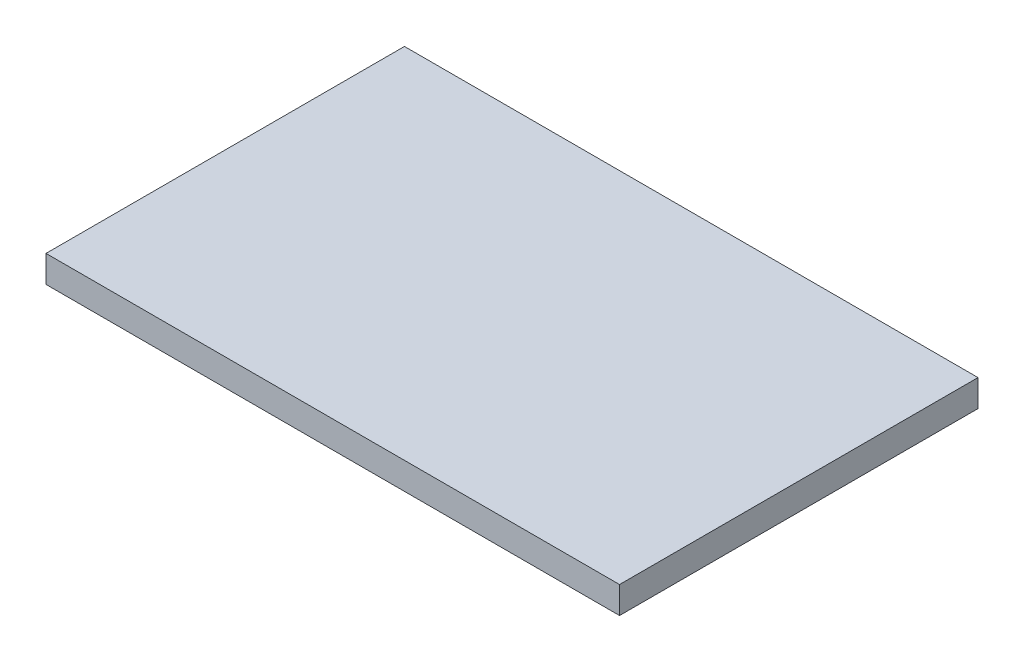
ISO-10303-21;
HEADER;
FILE_DESCRIPTION(('STEP AP214'),'2;1');
FILE_NAME('part.step','',(''),(''),'','','');
FILE_SCHEMA(('AUTOMOTIVE_DESIGN { 1 0 10303 214 1 1 1 1 }'));
ENDSEC;
DATA;
#1=APPLICATION_CONTEXT('core data for automotive mechanical design processes');
#2=APPLICATION_PROTOCOL_DEFINITION('international standard','automotive_design',2000,#1);
#3=PRODUCT_CONTEXT('',#1,'mechanical');
#4=PRODUCT('Part','Part','',(#3));
#5=PRODUCT_RELATED_PRODUCT_CATEGORY('part','',(#4));
#6=PRODUCT_DEFINITION_FORMATION('','',#4);
#7=PRODUCT_DEFINITION_CONTEXT('part definition',#1,'design');
#8=PRODUCT_DEFINITION('design','',#6,#7);
#9=PRODUCT_DEFINITION_SHAPE('','',#8);
#10=(LENGTH_UNIT() NAMED_UNIT(*) SI_UNIT(.MILLI.,.METRE.));
#11=(NAMED_UNIT(*) PLANE_ANGLE_UNIT() SI_UNIT($,.RADIAN.));
#12=(NAMED_UNIT(*) SI_UNIT($,.STERADIAN.) SOLID_ANGLE_UNIT());
#13=UNCERTAINTY_MEASURE_WITH_UNIT(LENGTH_MEASURE(1.E-05),#10,'distance_accuracy_value','');
#14=(GEOMETRIC_REPRESENTATION_CONTEXT(3) GLOBAL_UNCERTAINTY_ASSIGNED_CONTEXT((#13)) GLOBAL_UNIT_ASSIGNED_CONTEXT((#10,
#11,#12)) REPRESENTATION_CONTEXT('',''));
#15=CARTESIAN_POINT('',(0.,0.,0.));
#16=DIRECTION('',(0.,0.,1.));
#17=DIRECTION('',(1.,0.,0.));
#18=AXIS2_PLACEMENT_3D('',#15,#16,#17);
#19=CARTESIAN_POINT('',(-16.,-0.750000000000004,20.));
#20=DIRECTION('',(1.,0.,0.));
#21=DIRECTION('',(0.,0.,-1.));
#22=AXIS2_PLACEMENT_3D('',#19,#20,#21);
#23=PLANE('',#22);
#24=DIRECTION('',(0.,-1.,0.));
#25=VECTOR('',#24,1.);
#26=CARTESIAN_POINT('',(-16.,-0.750000000000004,0.));
#27=LINE('',#26,#25);
#28=CARTESIAN_POINT('',(-16.,0.749999999999996,0.));
#29=VERTEX_POINT('',#28);
#30=CARTESIAN_POINT('',(-16.,-0.750000000000004,0.));
#31=VERTEX_POINT('',#30);
#32=EDGE_CURVE('E113',#29,#31,#27,.T.);
#33=ORIENTED_EDGE('',*,*,#32,.T.);
#34=DIRECTION('',(0.,0.,-1.));
#35=VECTOR('',#34,1.);
#36=CARTESIAN_POINT('',(-16.,-0.750000000000004,20.));
#37=LINE('',#36,#35);
#38=CARTESIAN_POINT('',(-16.,-0.750000000000004,20.));
#39=VERTEX_POINT('',#38);
#40=EDGE_CURVE('E11',#39,#31,#37,.T.);
#41=ORIENTED_EDGE('',*,*,#40,.F.);
#42=DIRECTION('',(0.,-1.,0.));
#43=VECTOR('',#42,1.);
#44=CARTESIAN_POINT('',(-16.,-0.750000000000004,20.));
#45=LINE('',#44,#43);
#46=CARTESIAN_POINT('',(-16.,0.749999999999996,20.));
#47=VERTEX_POINT('',#46);
#48=EDGE_CURVE('E97',#47,#39,#45,.T.);
#49=ORIENTED_EDGE('',*,*,#48,.F.);
#50=DIRECTION('',(0.,0.,-1.));
#51=VECTOR('',#50,1.);
#52=CARTESIAN_POINT('',(-16.,0.749999999999996,20.));
#53=LINE('',#52,#51);
#54=EDGE_CURVE('E109',#47,#29,#53,.T.);
#55=ORIENTED_EDGE('',*,*,#54,.T.);
#56=EDGE_LOOP('',(#33,#41,#49,#55));
#57=FACE_BOUND('',#56,.T.);
#58=ADVANCED_FACE('F45',(#57),#23,.F.);
#59=CARTESIAN_POINT('',(16.,-0.749999999999994,20.));
#60=DIRECTION('',(0.,1.,0.));
#61=DIRECTION('',(-1.,0.,0.));
#62=AXIS2_PLACEMENT_3D('',#59,#60,#61);
#63=PLANE('',#62);
#64=DIRECTION('',(1.,0.,0.));
#65=VECTOR('',#64,1.);
#66=CARTESIAN_POINT('',(16.,-0.749999999999994,0.));
#67=LINE('',#66,#65);
#68=CARTESIAN_POINT('',(16.,-0.749999999999994,0.));
#69=VERTEX_POINT('',#68);
#70=EDGE_CURVE('E102',#31,#69,#67,.T.);
#71=ORIENTED_EDGE('',*,*,#70,.T.);
#72=DIRECTION('',(0.,0.,-1.));
#73=VECTOR('',#72,1.);
#74=CARTESIAN_POINT('',(16.,-0.749999999999994,20.));
#75=LINE('',#74,#73);
#76=CARTESIAN_POINT('',(16.,-0.749999999999994,20.));
#77=VERTEX_POINT('',#76);
#78=EDGE_CURVE('E54',#77,#69,#75,.T.);
#79=ORIENTED_EDGE('',*,*,#78,.F.);
#80=DIRECTION('',(1.,0.,0.));
#81=VECTOR('',#80,1.);
#82=CARTESIAN_POINT('',(16.,-0.749999999999994,20.));
#83=LINE('',#82,#81);
#84=EDGE_CURVE('E92',#39,#77,#83,.T.);
#85=ORIENTED_EDGE('',*,*,#84,.F.);
#86=ORIENTED_EDGE('',*,*,#40,.T.);
#87=EDGE_LOOP('',(#71,#79,#85,#86));
#88=FACE_BOUND('',#87,.T.);
#89=ADVANCED_FACE('F101',(#88),#63,.F.);
#90=CARTESIAN_POINT('',(16.,-0.749999999999994,20.));
#91=DIRECTION('',(-1.,0.,0.));
#92=DIRECTION('',(0.,0.,1.));
#93=AXIS2_PLACEMENT_3D('',#90,#91,#92);
#94=PLANE('',#93);
#95=DIRECTION('',(0.,1.,0.));
#96=VECTOR('',#95,1.);
#97=CARTESIAN_POINT('',(16.,-0.749999999999994,0.));
#98=LINE('',#97,#96);
#99=CARTESIAN_POINT('',(16.,0.750000000000006,0.));
#100=VERTEX_POINT('',#99);
#101=EDGE_CURVE('E79',#69,#100,#98,.T.);
#102=ORIENTED_EDGE('',*,*,#101,.T.);
#103=DIRECTION('',(0.,0.,-1.));
#104=VECTOR('',#103,1.);
#105=CARTESIAN_POINT('',(16.,0.750000000000006,20.));
#106=LINE('',#105,#104);
#107=CARTESIAN_POINT('',(16.,0.750000000000006,20.));
#108=VERTEX_POINT('',#107);
#109=EDGE_CURVE('E104',#108,#100,#106,.T.);
#110=ORIENTED_EDGE('',*,*,#109,.F.);
#111=DIRECTION('',(0.,1.,0.));
#112=VECTOR('',#111,1.);
#113=CARTESIAN_POINT('',(16.,-0.749999999999994,20.));
#114=LINE('',#113,#112);
#115=EDGE_CURVE('E95',#77,#108,#114,.T.);
#116=ORIENTED_EDGE('',*,*,#115,.F.);
#117=ORIENTED_EDGE('',*,*,#78,.T.);
#118=EDGE_LOOP('',(#102,#110,#116,#117));
#119=FACE_BOUND('',#118,.T.);
#120=ADVANCED_FACE('F105',(#119),#94,.F.);
#121=CARTESIAN_POINT('',(16.,0.750000000000006,20.));
#122=DIRECTION('',(0.,-1.,0.));
#123=DIRECTION('',(1.,0.,0.));
#124=AXIS2_PLACEMENT_3D('',#121,#122,#123);
#125=PLANE('',#124);
#126=DIRECTION('',(-1.,0.,0.));
#127=VECTOR('',#126,1.);
#128=CARTESIAN_POINT('',(16.,0.750000000000006,0.));
#129=LINE('',#128,#127);
#130=EDGE_CURVE('E85',#100,#29,#129,.T.);
#131=ORIENTED_EDGE('',*,*,#130,.T.);
#132=ORIENTED_EDGE('',*,*,#54,.F.);
#133=DIRECTION('',(-1.,0.,0.));
#134=VECTOR('',#133,1.);
#135=CARTESIAN_POINT('',(16.,0.750000000000006,20.));
#136=LINE('',#135,#134);
#137=EDGE_CURVE('E62',#108,#47,#136,.T.);
#138=ORIENTED_EDGE('',*,*,#137,.F.);
#139=ORIENTED_EDGE('',*,*,#109,.T.);
#140=EDGE_LOOP('',(#131,#132,#138,#139));
#141=FACE_BOUND('',#140,.T.);
#142=ADVANCED_FACE('F126',(#141),#125,.F.);
#143=CARTESIAN_POINT('',(0.,0.,20.));
#144=DIRECTION('',(0.,0.,1.));
#145=DIRECTION('',(1.,0.,0.));
#146=AXIS2_PLACEMENT_3D('',#143,#144,#145);
#147=PLANE('',#146);
#148=ORIENTED_EDGE('',*,*,#48,.T.);
#149=ORIENTED_EDGE('',*,*,#84,.T.);
#150=ORIENTED_EDGE('',*,*,#115,.T.);
#151=ORIENTED_EDGE('',*,*,#137,.T.);
#152=EDGE_LOOP('',(#148,#149,#150,#151));
#153=FACE_BOUND('',#152,.T.);
#154=ADVANCED_FACE('F93',(#153),#147,.T.);
#155=CARTESIAN_POINT('',(0.,0.,0.));
#156=DIRECTION('',(0.,0.,1.));
#157=DIRECTION('',(1.,0.,0.));
#158=AXIS2_PLACEMENT_3D('',#155,#156,#157);
#159=PLANE('',#158);
#160=ORIENTED_EDGE('',*,*,#32,.F.);
#161=ORIENTED_EDGE('',*,*,#130,.F.);
#162=ORIENTED_EDGE('',*,*,#101,.F.);
#163=ORIENTED_EDGE('',*,*,#70,.F.);
#164=EDGE_LOOP('',(#160,#161,#162,#163));
#165=FACE_BOUND('',#164,.T.);
#166=ADVANCED_FACE('F129',(#165),#159,.F.);
#167=CLOSED_SHELL('',(#58,#89,#120,#142,#154,#166));
#168=MANIFOLD_SOLID_BREP('B2',#167);
#169=ADVANCED_BREP_SHAPE_REPRESENTATION('',(#18,#168),#14);
#170=SHAPE_DEFINITION_REPRESENTATION(#9,#169);
ENDSEC;
END-ISO-10303-21;
